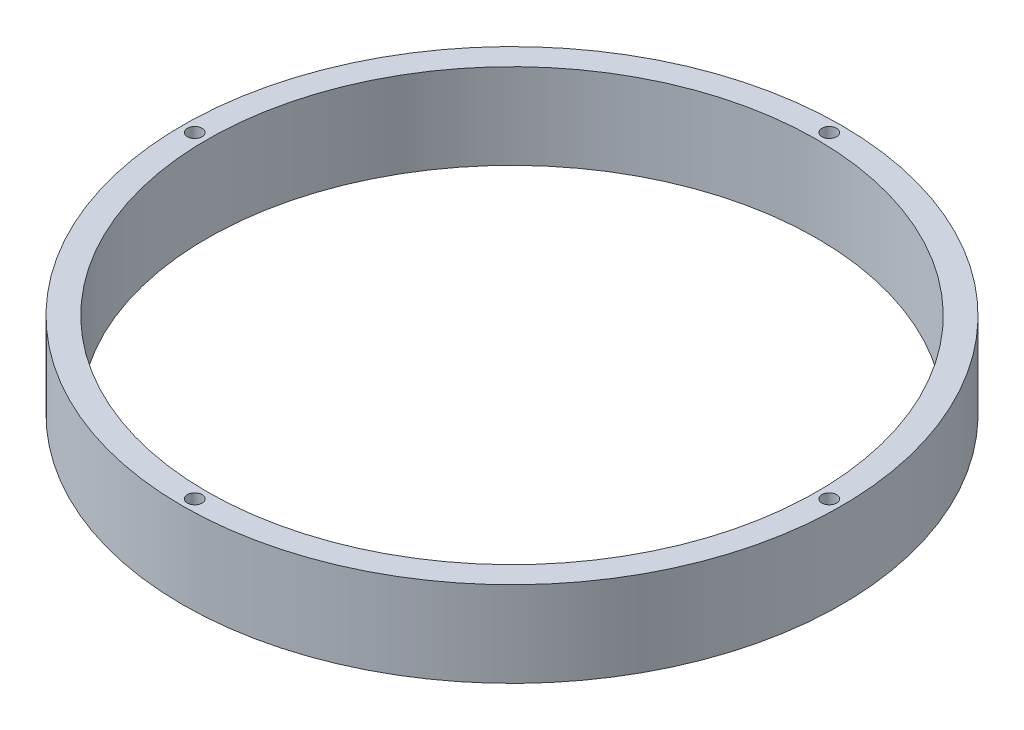
ISO-10303-21;
HEADER;
FILE_DESCRIPTION(('STEP AP214'),'2;1');
FILE_NAME('part.step','',(''),(''),'','','');
FILE_SCHEMA(('AUTOMOTIVE_DESIGN { 1 0 10303 214 1 1 1 1 }'));
ENDSEC;
DATA;
#1=APPLICATION_CONTEXT('core data for automotive mechanical design processes');
#2=APPLICATION_PROTOCOL_DEFINITION('international standard','automotive_design',2000,#1);
#3=PRODUCT_CONTEXT('',#1,'mechanical');
#4=PRODUCT('Part','Part','',(#3));
#5=PRODUCT_RELATED_PRODUCT_CATEGORY('part','',(#4));
#6=PRODUCT_DEFINITION_FORMATION('','',#4);
#7=PRODUCT_DEFINITION_CONTEXT('part definition',#1,'design');
#8=PRODUCT_DEFINITION('design','',#6,#7);
#9=PRODUCT_DEFINITION_SHAPE('','',#8);
#10=(LENGTH_UNIT() NAMED_UNIT(*) SI_UNIT(.MILLI.,.METRE.));
#11=(NAMED_UNIT(*) PLANE_ANGLE_UNIT() SI_UNIT($,.RADIAN.));
#12=(NAMED_UNIT(*) SI_UNIT($,.STERADIAN.) SOLID_ANGLE_UNIT());
#13=UNCERTAINTY_MEASURE_WITH_UNIT(LENGTH_MEASURE(1.E-05),#10,'distance_accuracy_value','');
#14=(GEOMETRIC_REPRESENTATION_CONTEXT(3) GLOBAL_UNCERTAINTY_ASSIGNED_CONTEXT((#13)) GLOBAL_UNIT_ASSIGNED_CONTEXT((#10,
#11,#12)) REPRESENTATION_CONTEXT('',''));
#15=CARTESIAN_POINT('',(0.,0.,0.));
#16=DIRECTION('',(0.,0.,1.));
#17=DIRECTION('',(1.,0.,0.));
#18=AXIS2_PLACEMENT_3D('',#15,#16,#17);
#19=CARTESIAN_POINT('',(2.94094773025341E-13,0.,-2.16832645731163E-13));
#20=DIRECTION('',(0.,1.,0.));
#21=DIRECTION('',(0.,0.,-1.));
#22=AXIS2_PLACEMENT_3D('',#19,#20,#21);
#23=PLANE('',#22);
#24=CARTESIAN_POINT('',(0.,0.,-64.5));
#25=DIRECTION('',(0.,1.,0.));
#26=DIRECTION('',(0.,0.,1.));
#27=AXIS2_PLACEMENT_3D('',#24,#25,#26);
#28=CIRCLE('',#27,1.5);
#29=CARTESIAN_POINT('',(0.,0.,-63.));
#30=VERTEX_POINT('',#29);
#31=EDGE_CURVE('E76',#30,#30,#28,.T.);
#32=ORIENTED_EDGE('',*,*,#31,.T.);
#33=EDGE_LOOP('',(#32));
#34=FACE_BOUND('',#33,.T.);
#35=CARTESIAN_POINT('',(64.5000000000001,0.,-5.14876904683755E-13));
#36=DIRECTION('',(0.,1.,0.));
#37=DIRECTION('',(0.,0.,1.));
#38=AXIS2_PLACEMENT_3D('',#35,#36,#37);
#39=CIRCLE('',#38,1.49999999999998);
#40=CARTESIAN_POINT('',(64.5000000000001,0.,1.49999999999947));
#41=VERTEX_POINT('',#40);
#42=EDGE_CURVE('E73',#41,#41,#39,.T.);
#43=ORIENTED_EDGE('',*,*,#42,.T.);
#44=EDGE_LOOP('',(#43));
#45=FACE_BOUND('',#44,.T.);
#46=CARTESIAN_POINT('',(5.96088517905183E-13,0.,64.4999999999996));
#47=DIRECTION('',(0.,1.,0.));
#48=DIRECTION('',(0.,0.,1.));
#49=AXIS2_PLACEMENT_3D('',#46,#47,#48);
#50=CIRCLE('',#49,1.5);
#51=CARTESIAN_POINT('',(5.96088517905183E-13,0.,65.9999999999996));
#52=VERTEX_POINT('',#51);
#53=EDGE_CURVE('E67',#52,#52,#50,.T.);
#54=ORIENTED_EDGE('',*,*,#53,.T.);
#55=EDGE_LOOP('',(#54));
#56=FACE_BOUND('',#55,.T.);
#57=CARTESIAN_POINT('',(-64.4999999999995,0.,0.));
#58=DIRECTION('',(0.,1.,0.));
#59=DIRECTION('',(0.,0.,1.));
#60=AXIS2_PLACEMENT_3D('',#57,#58,#59);
#61=CIRCLE('',#60,1.5);
#62=CARTESIAN_POINT('',(-64.4999999999995,0.,1.50000000000009));
#63=VERTEX_POINT('',#62);
#64=EDGE_CURVE('E61',#63,#63,#61,.T.);
#65=ORIENTED_EDGE('',*,*,#64,.T.);
#66=EDGE_LOOP('',(#65));
#67=FACE_BOUND('',#66,.T.);
#68=CARTESIAN_POINT('',(2.94094773025341E-13,0.,-2.16832645731163E-13));
#69=DIRECTION('',(0.,-1.,0.));
#70=DIRECTION('',(0.,0.,-1.));
#71=AXIS2_PLACEMENT_3D('',#68,#69,#70);
#72=CIRCLE('',#71,66.9999999999998);
#73=CARTESIAN_POINT('',(2.94094773025341E-13,0.,-67.));
#74=VERTEX_POINT('',#73);
#75=EDGE_CURVE('E10',#74,#74,#72,.T.);
#76=ORIENTED_EDGE('',*,*,#75,.T.);
#77=EDGE_LOOP('',(#76));
#78=FACE_BOUND('',#77,.T.);
#79=CARTESIAN_POINT('',(2.94094773025341E-13,0.,-2.16832645731163E-13));
#80=DIRECTION('',(0.,-1.,0.));
#81=DIRECTION('',(0.,0.,-1.));
#82=AXIS2_PLACEMENT_3D('',#79,#80,#81);
#83=CIRCLE('',#82,62.);
#84=CARTESIAN_POINT('',(2.94094773025341E-13,0.,-62.0000000000002));
#85=VERTEX_POINT('',#84);
#86=EDGE_CURVE('E43',#85,#85,#83,.T.);
#87=ORIENTED_EDGE('',*,*,#86,.F.);
#88=EDGE_LOOP('',(#87));
#89=FACE_BOUND('',#88,.T.);
#90=ADVANCED_FACE('F39',(#34,#45,#56,#67,#78,#89),#23,.F.);
#91=CARTESIAN_POINT('',(2.94094773025341E-13,203.004617357988,-2.16832645731163E-13));
#92=DIRECTION('',(0.,-1.,0.));
#93=DIRECTION('',(0.,0.,1.));
#94=AXIS2_PLACEMENT_3D('',#91,#92,#93);
#95=CYLINDRICAL_SURFACE('',#94,66.9999999999998);
#96=ORIENTED_EDGE('',*,*,#75,.F.);
#97=EDGE_LOOP('',(#96));
#98=FACE_BOUND('',#97,.T.);
#99=CARTESIAN_POINT('',(4.6135881972745E-12,17.374999999997,5.95121799314737E-12));
#100=DIRECTION('',(0.,-1.,0.));
#101=DIRECTION('',(0.,0.,-1.));
#102=AXIS2_PLACEMENT_3D('',#99,#100,#101);
#103=CIRCLE('',#102,66.9999999999937);
#104=CARTESIAN_POINT('',(4.6135881972745E-12,17.374999999997,-66.9999999999877));
#105=VERTEX_POINT('',#104);
#106=EDGE_CURVE('E50',#105,#105,#103,.T.);
#107=ORIENTED_EDGE('',*,*,#106,.T.);
#108=EDGE_LOOP('',(#107));
#109=FACE_BOUND('',#108,.T.);
#110=ADVANCED_FACE('F100',(#98,#109),#95,.T.);
#111=CARTESIAN_POINT('',(2.94094773025341E-13,203.004617357988,-2.16832645731163E-13));
#112=DIRECTION('',(0.,-1.,0.));
#113=DIRECTION('',(0.,0.,1.));
#114=AXIS2_PLACEMENT_3D('',#111,#112,#113);
#115=CYLINDRICAL_SURFACE('',#114,62.);
#116=ORIENTED_EDGE('',*,*,#86,.T.);
#117=EDGE_LOOP('',(#116));
#118=FACE_BOUND('',#117,.T.);
#119=CARTESIAN_POINT('',(4.6135881972745E-12,17.374999999997,5.95121799314737E-12));
#120=DIRECTION('',(0.,-1.,0.));
#121=DIRECTION('',(0.,0.,-1.));
#122=AXIS2_PLACEMENT_3D('',#119,#120,#121);
#123=CIRCLE('',#122,61.9999999999942);
#124=CARTESIAN_POINT('',(4.6135881972745E-12,17.374999999997,-61.9999999999882));
#125=VERTEX_POINT('',#124);
#126=EDGE_CURVE('E52',#125,#125,#123,.T.);
#127=ORIENTED_EDGE('',*,*,#126,.F.);
#128=EDGE_LOOP('',(#127));
#129=FACE_BOUND('',#128,.T.);
#130=ADVANCED_FACE('F41',(#118,#129),#115,.F.);
#131=CARTESIAN_POINT('',(2.14100998919788E-12,17.374999999997,-3.77040438869194E-12));
#132=DIRECTION('',(0.,1.,0.));
#133=DIRECTION('',(0.,0.,-1.));
#134=AXIS2_PLACEMENT_3D('',#131,#132,#133);
#135=PLANE('',#134);
#136=CARTESIAN_POINT('',(0.,17.374999999997,-64.5));
#137=DIRECTION('',(0.,1.,0.));
#138=DIRECTION('',(0.,0.,1.));
#139=AXIS2_PLACEMENT_3D('',#136,#137,#138);
#140=CIRCLE('',#139,1.5);
#141=CARTESIAN_POINT('',(0.,17.374999999997,-63.));
#142=VERTEX_POINT('',#141);
#143=EDGE_CURVE('E55',#142,#142,#140,.T.);
#144=ORIENTED_EDGE('',*,*,#143,.F.);
#145=EDGE_LOOP('',(#144));
#146=FACE_BOUND('',#145,.T.);
#147=CARTESIAN_POINT('',(64.5000000000001,17.374999999997,-5.14876904683755E-13));
#148=DIRECTION('',(0.,1.,0.));
#149=DIRECTION('',(0.,0.,1.));
#150=AXIS2_PLACEMENT_3D('',#147,#148,#149);
#151=CIRCLE('',#150,1.49999999999998);
#152=CARTESIAN_POINT('',(64.5000000000001,17.374999999997,1.49999999999947));
#153=VERTEX_POINT('',#152);
#154=EDGE_CURVE('E70',#153,#153,#151,.T.);
#155=ORIENTED_EDGE('',*,*,#154,.F.);
#156=EDGE_LOOP('',(#155));
#157=FACE_BOUND('',#156,.T.);
#158=CARTESIAN_POINT('',(5.96088517905183E-13,17.374999999997,64.4999999999996));
#159=DIRECTION('',(0.,1.,0.));
#160=DIRECTION('',(0.,0.,1.));
#161=AXIS2_PLACEMENT_3D('',#158,#159,#160);
#162=CIRCLE('',#161,1.5);
#163=CARTESIAN_POINT('',(5.96088517905183E-13,17.374999999997,65.9999999999996));
#164=VERTEX_POINT('',#163);
#165=EDGE_CURVE('E64',#164,#164,#162,.T.);
#166=ORIENTED_EDGE('',*,*,#165,.F.);
#167=EDGE_LOOP('',(#166));
#168=FACE_BOUND('',#167,.T.);
#169=CARTESIAN_POINT('',(-64.4999999999995,17.374999999997,0.));
#170=DIRECTION('',(0.,1.,0.));
#171=DIRECTION('',(0.,0.,1.));
#172=AXIS2_PLACEMENT_3D('',#169,#170,#171);
#173=CIRCLE('',#172,1.5);
#174=CARTESIAN_POINT('',(-64.4999999999995,17.374999999997,1.50000000000009));
#175=VERTEX_POINT('',#174);
#176=EDGE_CURVE('E58',#175,#175,#173,.T.);
#177=ORIENTED_EDGE('',*,*,#176,.F.);
#178=EDGE_LOOP('',(#177));
#179=FACE_BOUND('',#178,.T.);
#180=ORIENTED_EDGE('',*,*,#126,.T.);
#181=EDGE_LOOP('',(#180));
#182=FACE_BOUND('',#181,.T.);
#183=ORIENTED_EDGE('',*,*,#106,.F.);
#184=EDGE_LOOP('',(#183));
#185=FACE_BOUND('',#184,.T.);
#186=ADVANCED_FACE('F85',(#146,#157,#168,#179,#182,#185),#135,.T.);
#187=CARTESIAN_POINT('',(-64.4999999999995,17.374999999997,0.));
#188=DIRECTION('',(0.,-1.,0.));
#189=DIRECTION('',(0.,0.,1.));
#190=AXIS2_PLACEMENT_3D('',#187,#188,#189);
#191=CYLINDRICAL_SURFACE('',#190,1.5);
#192=ORIENTED_EDGE('',*,*,#176,.T.);
#193=EDGE_LOOP('',(#192));
#194=FACE_BOUND('',#193,.T.);
#195=ORIENTED_EDGE('',*,*,#64,.F.);
#196=EDGE_LOOP('',(#195));
#197=FACE_BOUND('',#196,.T.);
#198=ADVANCED_FACE('F88',(#194,#197),#191,.F.);
#199=CARTESIAN_POINT('',(5.96088517905183E-13,17.374999999997,64.4999999999996));
#200=DIRECTION('',(0.,-1.,0.));
#201=DIRECTION('',(0.,0.,1.));
#202=AXIS2_PLACEMENT_3D('',#199,#200,#201);
#203=CYLINDRICAL_SURFACE('',#202,1.5);
#204=ORIENTED_EDGE('',*,*,#165,.T.);
#205=EDGE_LOOP('',(#204));
#206=FACE_BOUND('',#205,.T.);
#207=ORIENTED_EDGE('',*,*,#53,.F.);
#208=EDGE_LOOP('',(#207));
#209=FACE_BOUND('',#208,.T.);
#210=ADVANCED_FACE('F113',(#206,#209),#203,.F.);
#211=CARTESIAN_POINT('',(64.5000000000001,17.374999999997,-5.14876904683755E-13));
#212=DIRECTION('',(0.,-1.,0.));
#213=DIRECTION('',(0.,0.,1.));
#214=AXIS2_PLACEMENT_3D('',#211,#212,#213);
#215=CYLINDRICAL_SURFACE('',#214,1.49999999999998);
#216=ORIENTED_EDGE('',*,*,#154,.T.);
#217=EDGE_LOOP('',(#216));
#218=FACE_BOUND('',#217,.T.);
#219=ORIENTED_EDGE('',*,*,#42,.F.);
#220=EDGE_LOOP('',(#219));
#221=FACE_BOUND('',#220,.T.);
#222=ADVANCED_FACE('F117',(#218,#221),#215,.F.);
#223=CARTESIAN_POINT('',(0.,17.374999999997,-64.5));
#224=DIRECTION('',(0.,-1.,0.));
#225=DIRECTION('',(0.,0.,1.));
#226=AXIS2_PLACEMENT_3D('',#223,#224,#225);
#227=CYLINDRICAL_SURFACE('',#226,1.5);
#228=ORIENTED_EDGE('',*,*,#143,.T.);
#229=EDGE_LOOP('',(#228));
#230=FACE_BOUND('',#229,.T.);
#231=ORIENTED_EDGE('',*,*,#31,.F.);
#232=EDGE_LOOP('',(#231));
#233=FACE_BOUND('',#232,.T.);
#234=ADVANCED_FACE('F82',(#230,#233),#227,.F.);
#235=CLOSED_SHELL('',(#90,#110,#130,#186,#198,#210,#222,#234));
#236=MANIFOLD_SOLID_BREP('B2',#235);
#237=ADVANCED_BREP_SHAPE_REPRESENTATION('',(#18,#236),#14);
#238=SHAPE_DEFINITION_REPRESENTATION(#9,#237);
ENDSEC;
END-ISO-10303-21;
